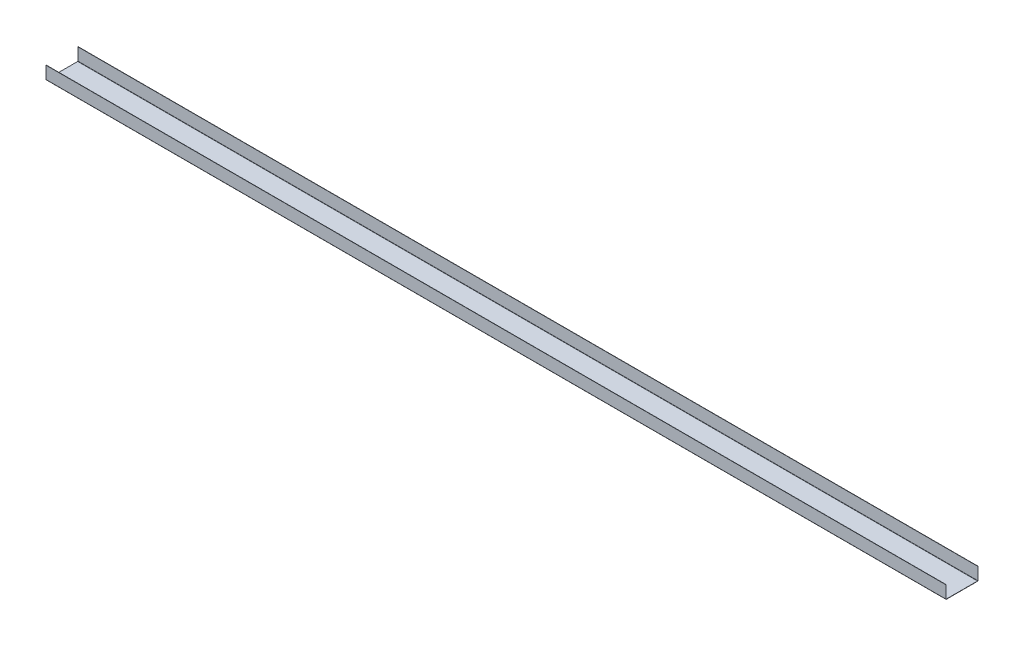
ISO-10303-21;
HEADER;
FILE_DESCRIPTION(('STEP AP214'),'2;1');
FILE_NAME('part.step','',(''),(''),'','','');
FILE_SCHEMA(('AUTOMOTIVE_DESIGN { 1 0 10303 214 1 1 1 1 }'));
ENDSEC;
DATA;
#1=APPLICATION_CONTEXT('core data for automotive mechanical design processes');
#2=APPLICATION_PROTOCOL_DEFINITION('international standard','automotive_design',2000,#1);
#3=PRODUCT_CONTEXT('',#1,'mechanical');
#4=PRODUCT('Part','Part','',(#3));
#5=PRODUCT_RELATED_PRODUCT_CATEGORY('part','',(#4));
#6=PRODUCT_DEFINITION_FORMATION('','',#4);
#7=PRODUCT_DEFINITION_CONTEXT('part definition',#1,'design');
#8=PRODUCT_DEFINITION('design','',#6,#7);
#9=PRODUCT_DEFINITION_SHAPE('','',#8);
#10=(LENGTH_UNIT() NAMED_UNIT(*) SI_UNIT(.MILLI.,.METRE.));
#11=(NAMED_UNIT(*) PLANE_ANGLE_UNIT() SI_UNIT($,.RADIAN.));
#12=(NAMED_UNIT(*) SI_UNIT($,.STERADIAN.) SOLID_ANGLE_UNIT());
#13=UNCERTAINTY_MEASURE_WITH_UNIT(LENGTH_MEASURE(1.E-05),#10,'distance_accuracy_value','');
#14=(GEOMETRIC_REPRESENTATION_CONTEXT(3) GLOBAL_UNCERTAINTY_ASSIGNED_CONTEXT((#13)) GLOBAL_UNIT_ASSIGNED_CONTEXT((#10,
#11,#12)) REPRESENTATION_CONTEXT('',''));
#15=CARTESIAN_POINT('',(0.,0.,0.));
#16=DIRECTION('',(0.,0.,1.));
#17=DIRECTION('',(1.,0.,0.));
#18=AXIS2_PLACEMENT_3D('',#15,#16,#17);
#19=CARTESIAN_POINT('',(2800.,1.5,100.));
#20=DIRECTION('',(1.,0.,0.));
#21=DIRECTION('',(0.,0.,-1.));
#22=AXIS2_PLACEMENT_3D('',#19,#20,#21);
#23=PLANE('',#22);
#24=DIRECTION('',(0.,0.,-1.));
#25=VECTOR('',#24,1.);
#26=CARTESIAN_POINT('',(2800.,1.5,100.));
#27=LINE('',#26,#25);
#28=CARTESIAN_POINT('',(2800.,1.5,100.));
#29=VERTEX_POINT('',#28);
#30=CARTESIAN_POINT('',(2800.,1.5,99.25));
#31=VERTEX_POINT('',#30);
#32=EDGE_CURVE('E11',#29,#31,#27,.T.);
#33=ORIENTED_EDGE('',*,*,#32,.F.);
#34=CARTESIAN_POINT('',(2800.,1.5,98.5));
#35=DIRECTION('',(-1.,0.,0.));
#36=DIRECTION('',(0.,0.,1.));
#37=AXIS2_PLACEMENT_3D('',#34,#35,#36);
#38=CIRCLE('',#37,1.5);
#39=CARTESIAN_POINT('',(2800.,0.,98.5));
#40=VERTEX_POINT('',#39);
#41=EDGE_CURVE('E146',#29,#40,#38,.F.);
#42=ORIENTED_EDGE('',*,*,#41,.T.);
#43=DIRECTION('',(0.,-1.,0.));
#44=VECTOR('',#43,1.);
#45=CARTESIAN_POINT('',(2800.,0.75,98.5));
#46=LINE('',#45,#44);
#47=CARTESIAN_POINT('',(2800.,0.75,98.5));
#48=VERTEX_POINT('',#47);
#49=EDGE_CURVE('E44',#48,#40,#46,.T.);
#50=ORIENTED_EDGE('',*,*,#49,.F.);
#51=CARTESIAN_POINT('',(2800.,1.5,98.5));
#52=DIRECTION('',(1.,0.,0.));
#53=DIRECTION('',(0.,0.,-1.));
#54=AXIS2_PLACEMENT_3D('',#51,#52,#53);
#55=CIRCLE('',#54,0.75);
#56=EDGE_CURVE('E240',#31,#48,#55,.T.);
#57=ORIENTED_EDGE('',*,*,#56,.F.);
#58=EDGE_LOOP('',(#33,#42,#50,#57));
#59=FACE_BOUND('',#58,.T.);
#60=ADVANCED_FACE('F36',(#59),#23,.T.);
#61=CARTESIAN_POINT('',(2800.,0.75,98.5));
#62=DIRECTION('',(1.,0.,0.));
#63=DIRECTION('',(0.,0.,-1.));
#64=AXIS2_PLACEMENT_3D('',#61,#62,#63);
#65=PLANE('',#64);
#66=DIRECTION('',(0.,-1.,0.));
#67=VECTOR('',#66,1.);
#68=CARTESIAN_POINT('',(2800.,0.,100.));
#69=LINE('',#68,#67);
#70=CARTESIAN_POINT('',(2800.,40.,100.));
#71=VERTEX_POINT('',#70);
#72=EDGE_CURVE('E151',#71,#29,#69,.T.);
#73=ORIENTED_EDGE('',*,*,#72,.T.);
#74=ORIENTED_EDGE('',*,*,#32,.T.);
#75=DIRECTION('',(0.,1.,0.));
#76=VECTOR('',#75,1.);
#77=CARTESIAN_POINT('',(2800.,0.,99.25));
#78=LINE('',#77,#76);
#79=CARTESIAN_POINT('',(2800.,40.,99.25));
#80=VERTEX_POINT('',#79);
#81=EDGE_CURVE('E253',#80,#31,#78,.F.);
#82=ORIENTED_EDGE('',*,*,#81,.F.);
#83=DIRECTION('',(0.,0.,-1.));
#84=VECTOR('',#83,1.);
#85=CARTESIAN_POINT('',(2800.,40.,100.));
#86=LINE('',#85,#84);
#87=EDGE_CURVE('E255',#71,#80,#86,.T.);
#88=ORIENTED_EDGE('',*,*,#87,.F.);
#89=EDGE_LOOP('',(#73,#74,#82,#88));
#90=FACE_BOUND('',#89,.T.);
#91=ADVANCED_FACE('F266',(#90),#65,.T.);
#92=CARTESIAN_POINT('',(0.,0.,98.5));
#93=DIRECTION('',(-1.,0.,0.));
#94=DIRECTION('',(0.,0.,1.));
#95=AXIS2_PLACEMENT_3D('',#92,#93,#94);
#96=PLANE('',#95);
#97=DIRECTION('',(0.,1.,0.));
#98=VECTOR('',#97,1.);
#99=CARTESIAN_POINT('',(0.,0.,98.5));
#100=LINE('',#99,#98);
#101=CARTESIAN_POINT('',(0.,0.,98.5));
#102=VERTEX_POINT('',#101);
#103=CARTESIAN_POINT('',(0.,0.75,98.5));
#104=VERTEX_POINT('',#103);
#105=EDGE_CURVE('E144',#102,#104,#100,.T.);
#106=ORIENTED_EDGE('',*,*,#105,.F.);
#107=CARTESIAN_POINT('',(0.,1.5,98.5));
#108=DIRECTION('',(-1.,0.,0.));
#109=DIRECTION('',(0.,0.,1.));
#110=AXIS2_PLACEMENT_3D('',#107,#108,#109);
#111=CIRCLE('',#110,1.5);
#112=CARTESIAN_POINT('',(0.,1.5,100.));
#113=VERTEX_POINT('',#112);
#114=EDGE_CURVE('E158',#113,#102,#111,.F.);
#115=ORIENTED_EDGE('',*,*,#114,.F.);
#116=DIRECTION('',(0.,0.,1.));
#117=VECTOR('',#116,1.);
#118=CARTESIAN_POINT('',(0.,1.5,99.25));
#119=LINE('',#118,#117);
#120=CARTESIAN_POINT('',(0.,1.5,99.25));
#121=VERTEX_POINT('',#120);
#122=EDGE_CURVE('E231',#121,#113,#119,.T.);
#123=ORIENTED_EDGE('',*,*,#122,.F.);
#124=CARTESIAN_POINT('',(0.,1.5,98.5));
#125=DIRECTION('',(1.,0.,0.));
#126=DIRECTION('',(0.,0.,-1.));
#127=AXIS2_PLACEMENT_3D('',#124,#125,#126);
#128=CIRCLE('',#127,0.75);
#129=EDGE_CURVE('E185',#121,#104,#128,.T.);
#130=ORIENTED_EDGE('',*,*,#129,.T.);
#131=EDGE_LOOP('',(#106,#115,#123,#130));
#132=FACE_BOUND('',#131,.T.);
#133=ADVANCED_FACE('F245',(#132),#96,.T.);
#134=CARTESIAN_POINT('',(0.,1.5,99.25));
#135=DIRECTION('',(-1.,0.,0.));
#136=DIRECTION('',(0.,0.,1.));
#137=AXIS2_PLACEMENT_3D('',#134,#135,#136);
#138=PLANE('',#137);
#139=DIRECTION('',(0.,0.,-1.));
#140=VECTOR('',#139,1.);
#141=CARTESIAN_POINT('',(0.,0.,100.));
#142=LINE('',#141,#140);
#143=CARTESIAN_POINT('',(0.,0.,1.5));
#144=VERTEX_POINT('',#143);
#145=EDGE_CURVE('E198',#102,#144,#142,.T.);
#146=ORIENTED_EDGE('',*,*,#145,.F.);
#147=ORIENTED_EDGE('',*,*,#105,.T.);
#148=DIRECTION('',(0.,0.,-1.));
#149=VECTOR('',#148,1.);
#150=CARTESIAN_POINT('',(0.,0.75,100.));
#151=LINE('',#150,#149);
#152=CARTESIAN_POINT('',(0.,0.75,1.5));
#153=VERTEX_POINT('',#152);
#154=EDGE_CURVE('E183',#104,#153,#151,.T.);
#155=ORIENTED_EDGE('',*,*,#154,.T.);
#156=DIRECTION('',(0.,-1.,0.));
#157=VECTOR('',#156,1.);
#158=CARTESIAN_POINT('',(0.,0.75,1.5));
#159=LINE('',#158,#157);
#160=EDGE_CURVE('E93',#153,#144,#159,.T.);
#161=ORIENTED_EDGE('',*,*,#160,.T.);
#162=EDGE_LOOP('',(#146,#147,#155,#161));
#163=FACE_BOUND('',#162,.T.);
#164=ADVANCED_FACE('F233',(#163),#138,.T.);
#165=CARTESIAN_POINT('',(2800.,0.,1.5));
#166=DIRECTION('',(1.,0.,0.));
#167=DIRECTION('',(0.,0.,-1.));
#168=AXIS2_PLACEMENT_3D('',#165,#166,#167);
#169=PLANE('',#168);
#170=DIRECTION('',(0.,1.,0.));
#171=VECTOR('',#170,1.);
#172=CARTESIAN_POINT('',(2800.,0.,1.5));
#173=LINE('',#172,#171);
#174=CARTESIAN_POINT('',(2800.,0.,1.5));
#175=VERTEX_POINT('',#174);
#176=CARTESIAN_POINT('',(2800.,0.75,1.5));
#177=VERTEX_POINT('',#176);
#178=EDGE_CURVE('E229',#175,#177,#173,.T.);
#179=ORIENTED_EDGE('',*,*,#178,.F.);
#180=CARTESIAN_POINT('',(2800.,1.5,1.5));
#181=DIRECTION('',(-1.,0.,0.));
#182=DIRECTION('',(0.,0.,1.));
#183=AXIS2_PLACEMENT_3D('',#180,#181,#182);
#184=CIRCLE('',#183,1.5);
#185=CARTESIAN_POINT('',(2800.,1.5,0.));
#186=VERTEX_POINT('',#185);
#187=EDGE_CURVE('E166',#175,#186,#184,.F.);
#188=ORIENTED_EDGE('',*,*,#187,.T.);
#189=DIRECTION('',(0.,0.,-1.));
#190=VECTOR('',#189,1.);
#191=CARTESIAN_POINT('',(2800.,1.5,0.75));
#192=LINE('',#191,#190);
#193=CARTESIAN_POINT('',(2800.,1.5,0.75));
#194=VERTEX_POINT('',#193);
#195=EDGE_CURVE('E52',#194,#186,#192,.T.);
#196=ORIENTED_EDGE('',*,*,#195,.F.);
#197=CARTESIAN_POINT('',(2800.,1.5,1.5));
#198=DIRECTION('',(1.,0.,0.));
#199=DIRECTION('',(0.,0.,-1.));
#200=AXIS2_PLACEMENT_3D('',#197,#198,#199);
#201=CIRCLE('',#200,0.75);
#202=EDGE_CURVE('E257',#177,#194,#201,.T.);
#203=ORIENTED_EDGE('',*,*,#202,.F.);
#204=EDGE_LOOP('',(#179,#188,#196,#203));
#205=FACE_BOUND('',#204,.T.);
#206=ADVANCED_FACE('F292',(#205),#169,.T.);
#207=CARTESIAN_POINT('',(2800.,1.5,0.75));
#208=DIRECTION('',(1.,0.,0.));
#209=DIRECTION('',(0.,0.,-1.));
#210=AXIS2_PLACEMENT_3D('',#207,#208,#209);
#211=PLANE('',#210);
#212=DIRECTION('',(0.,0.,-1.));
#213=VECTOR('',#212,1.);
#214=CARTESIAN_POINT('',(2800.,0.,100.));
#215=LINE('',#214,#213);
#216=EDGE_CURVE('E136',#40,#175,#215,.T.);
#217=ORIENTED_EDGE('',*,*,#216,.T.);
#218=ORIENTED_EDGE('',*,*,#178,.T.);
#219=DIRECTION('',(0.,0.,-1.));
#220=VECTOR('',#219,1.);
#221=CARTESIAN_POINT('',(2800.,0.75,100.));
#222=LINE('',#221,#220);
#223=EDGE_CURVE('E139',#48,#177,#222,.T.);
#224=ORIENTED_EDGE('',*,*,#223,.F.);
#225=ORIENTED_EDGE('',*,*,#49,.T.);
#226=EDGE_LOOP('',(#217,#218,#224,#225));
#227=FACE_BOUND('',#226,.T.);
#228=ADVANCED_FACE('F134',(#227),#211,.T.);
#229=CARTESIAN_POINT('',(0.,1.5,0.));
#230=DIRECTION('',(-1.,0.,0.));
#231=DIRECTION('',(0.,0.,1.));
#232=AXIS2_PLACEMENT_3D('',#229,#230,#231);
#233=PLANE('',#232);
#234=DIRECTION('',(0.,0.,1.));
#235=VECTOR('',#234,1.);
#236=CARTESIAN_POINT('',(0.,1.5,0.));
#237=LINE('',#236,#235);
#238=CARTESIAN_POINT('',(0.,1.5,0.));
#239=VERTEX_POINT('',#238);
#240=CARTESIAN_POINT('',(0.,1.5,0.75));
#241=VERTEX_POINT('',#240);
#242=EDGE_CURVE('E100',#239,#241,#237,.T.);
#243=ORIENTED_EDGE('',*,*,#242,.F.);
#244=CARTESIAN_POINT('',(0.,1.5,1.5));
#245=DIRECTION('',(-1.,0.,0.));
#246=DIRECTION('',(0.,0.,1.));
#247=AXIS2_PLACEMENT_3D('',#244,#245,#246);
#248=CIRCLE('',#247,1.5);
#249=EDGE_CURVE('E200',#144,#239,#248,.F.);
#250=ORIENTED_EDGE('',*,*,#249,.F.);
#251=ORIENTED_EDGE('',*,*,#160,.F.);
#252=CARTESIAN_POINT('',(0.,1.5,1.5));
#253=DIRECTION('',(1.,0.,0.));
#254=DIRECTION('',(0.,0.,-1.));
#255=AXIS2_PLACEMENT_3D('',#252,#253,#254);
#256=CIRCLE('',#255,0.75);
#257=EDGE_CURVE('E181',#153,#241,#256,.T.);
#258=ORIENTED_EDGE('',*,*,#257,.T.);
#259=EDGE_LOOP('',(#243,#250,#251,#258));
#260=FACE_BOUND('',#259,.T.);
#261=ADVANCED_FACE('F298',(#260),#233,.T.);
#262=CARTESIAN_POINT('',(0.,0.75,1.5));
#263=DIRECTION('',(-1.,0.,0.));
#264=DIRECTION('',(0.,0.,1.));
#265=AXIS2_PLACEMENT_3D('',#262,#263,#264);
#266=PLANE('',#265);
#267=DIRECTION('',(0.,1.,0.));
#268=VECTOR('',#267,1.);
#269=CARTESIAN_POINT('',(0.,0.,0.));
#270=LINE('',#269,#268);
#271=CARTESIAN_POINT('',(0.,40.,0.));
#272=VERTEX_POINT('',#271);
#273=EDGE_CURVE('E172',#239,#272,#270,.T.);
#274=ORIENTED_EDGE('',*,*,#273,.F.);
#275=ORIENTED_EDGE('',*,*,#242,.T.);
#276=DIRECTION('',(0.,1.,0.));
#277=VECTOR('',#276,1.);
#278=CARTESIAN_POINT('',(0.,0.,0.75));
#279=LINE('',#278,#277);
#280=CARTESIAN_POINT('',(0.,40.,0.75));
#281=VERTEX_POINT('',#280);
#282=EDGE_CURVE('E178',#241,#281,#279,.T.);
#283=ORIENTED_EDGE('',*,*,#282,.T.);
#284=DIRECTION('',(0.,0.,-1.));
#285=VECTOR('',#284,1.);
#286=CARTESIAN_POINT('',(0.,40.,0.75));
#287=LINE('',#286,#285);
#288=EDGE_CURVE('E175',#281,#272,#287,.T.);
#289=ORIENTED_EDGE('',*,*,#288,.T.);
#290=EDGE_LOOP('',(#274,#275,#283,#289));
#291=FACE_BOUND('',#290,.T.);
#292=ADVANCED_FACE('F301',(#291),#266,.T.);
#293=CARTESIAN_POINT('',(2800.,0.,0.));
#294=DIRECTION('',(0.,0.,1.));
#295=DIRECTION('',(0.,-1.,0.));
#296=AXIS2_PLACEMENT_3D('',#293,#294,#295);
#297=PLANE('',#296);
#298=ORIENTED_EDGE('',*,*,#273,.T.);
#299=DIRECTION('',(-1.,0.,0.));
#300=VECTOR('',#299,1.);
#301=CARTESIAN_POINT('',(2800.,40.,0.));
#302=LINE('',#301,#300);
#303=CARTESIAN_POINT('',(2800.,40.,0.));
#304=VERTEX_POINT('',#303);
#305=EDGE_CURVE('E224',#304,#272,#302,.T.);
#306=ORIENTED_EDGE('',*,*,#305,.F.);
#307=DIRECTION('',(0.,1.,0.));
#308=VECTOR('',#307,1.);
#309=CARTESIAN_POINT('',(2800.,0.,0.));
#310=LINE('',#309,#308);
#311=EDGE_CURVE('E106',#186,#304,#310,.T.);
#312=ORIENTED_EDGE('',*,*,#311,.F.);
#313=DIRECTION('',(-1.,0.,0.));
#314=VECTOR('',#313,1.);
#315=CARTESIAN_POINT('',(2800.,1.5,0.));
#316=LINE('',#315,#314);
#317=EDGE_CURVE('E168',#186,#239,#316,.T.);
#318=ORIENTED_EDGE('',*,*,#317,.T.);
#319=EDGE_LOOP('',(#298,#306,#312,#318));
#320=FACE_BOUND('',#319,.T.);
#321=ADVANCED_FACE('F304',(#320),#297,.F.);
#322=CARTESIAN_POINT('',(2800.,40.,0.75));
#323=DIRECTION('',(0.,1.,0.));
#324=DIRECTION('',(0.,0.,1.));
#325=AXIS2_PLACEMENT_3D('',#322,#323,#324);
#326=PLANE('',#325);
#327=ORIENTED_EDGE('',*,*,#288,.F.);
#328=DIRECTION('',(-1.,0.,0.));
#329=VECTOR('',#328,1.);
#330=CARTESIAN_POINT('',(2800.,40.,0.75));
#331=LINE('',#330,#329);
#332=CARTESIAN_POINT('',(2800.,40.,0.75));
#333=VERTEX_POINT('',#332);
#334=EDGE_CURVE('E222',#333,#281,#331,.T.);
#335=ORIENTED_EDGE('',*,*,#334,.F.);
#336=DIRECTION('',(0.,0.,-1.));
#337=VECTOR('',#336,1.);
#338=CARTESIAN_POINT('',(2800.,40.,0.75));
#339=LINE('',#338,#337);
#340=EDGE_CURVE('E512',#333,#304,#339,.T.);
#341=ORIENTED_EDGE('',*,*,#340,.T.);
#342=ORIENTED_EDGE('',*,*,#305,.T.);
#343=EDGE_LOOP('',(#327,#335,#341,#342));
#344=FACE_BOUND('',#343,.T.);
#345=ADVANCED_FACE('F308',(#344),#326,.T.);
#346=CARTESIAN_POINT('',(2800.,0.,0.75));
#347=DIRECTION('',(0.,0.,1.));
#348=DIRECTION('',(0.,-1.,0.));
#349=AXIS2_PLACEMENT_3D('',#346,#347,#348);
#350=PLANE('',#349);
#351=ORIENTED_EDGE('',*,*,#282,.F.);
#352=DIRECTION('',(-1.,0.,0.));
#353=VECTOR('',#352,1.);
#354=CARTESIAN_POINT('',(2800.,1.5,0.75));
#355=LINE('',#354,#353);
#356=EDGE_CURVE('E219',#194,#241,#355,.T.);
#357=ORIENTED_EDGE('',*,*,#356,.F.);
#358=DIRECTION('',(0.,1.,0.));
#359=VECTOR('',#358,1.);
#360=CARTESIAN_POINT('',(2800.,0.,0.75));
#361=LINE('',#360,#359);
#362=EDGE_CURVE('E514',#194,#333,#361,.T.);
#363=ORIENTED_EDGE('',*,*,#362,.T.);
#364=ORIENTED_EDGE('',*,*,#334,.T.);
#365=EDGE_LOOP('',(#351,#357,#363,#364));
#366=FACE_BOUND('',#365,.T.);
#367=ADVANCED_FACE('F312',(#366),#350,.T.);
#368=CARTESIAN_POINT('',(2800.,1.5,1.5));
#369=DIRECTION('',(-1.,0.,0.));
#370=DIRECTION('',(0.,0.,1.));
#371=AXIS2_PLACEMENT_3D('',#368,#369,#370);
#372=CYLINDRICAL_SURFACE('',#371,0.75);
#373=ORIENTED_EDGE('',*,*,#257,.F.);
#374=DIRECTION('',(-1.,0.,0.));
#375=VECTOR('',#374,1.);
#376=CARTESIAN_POINT('',(2800.,0.75,1.5));
#377=LINE('',#376,#375);
#378=EDGE_CURVE('E216',#177,#153,#377,.T.);
#379=ORIENTED_EDGE('',*,*,#378,.F.);
#380=ORIENTED_EDGE('',*,*,#202,.T.);
#381=ORIENTED_EDGE('',*,*,#356,.T.);
#382=EDGE_LOOP('',(#373,#379,#380,#381));
#383=FACE_BOUND('',#382,.T.);
#384=ADVANCED_FACE('F316',(#383),#372,.F.);
#385=CARTESIAN_POINT('',(2800.,0.75,100.));
#386=DIRECTION('',(0.,1.,0.));
#387=DIRECTION('',(0.,0.,1.));
#388=AXIS2_PLACEMENT_3D('',#385,#386,#387);
#389=PLANE('',#388);
#390=ORIENTED_EDGE('',*,*,#154,.F.);
#391=DIRECTION('',(-1.,0.,0.));
#392=VECTOR('',#391,1.);
#393=CARTESIAN_POINT('',(2800.,0.75,98.5));
#394=LINE('',#393,#392);
#395=EDGE_CURVE('E213',#48,#104,#394,.T.);
#396=ORIENTED_EDGE('',*,*,#395,.F.);
#397=ORIENTED_EDGE('',*,*,#223,.T.);
#398=ORIENTED_EDGE('',*,*,#378,.T.);
#399=EDGE_LOOP('',(#390,#396,#397,#398));
#400=FACE_BOUND('',#399,.T.);
#401=ADVANCED_FACE('F242',(#400),#389,.T.);
#402=CARTESIAN_POINT('',(2800.,1.5,98.5));
#403=DIRECTION('',(-1.,0.,0.));
#404=DIRECTION('',(0.,0.,1.));
#405=AXIS2_PLACEMENT_3D('',#402,#403,#404);
#406=CYLINDRICAL_SURFACE('',#405,0.75);
#407=ORIENTED_EDGE('',*,*,#129,.F.);
#408=DIRECTION('',(-1.,0.,0.));
#409=VECTOR('',#408,1.);
#410=CARTESIAN_POINT('',(2800.,1.5,99.25));
#411=LINE('',#410,#409);
#412=EDGE_CURVE('E210',#31,#121,#411,.T.);
#413=ORIENTED_EDGE('',*,*,#412,.F.);
#414=ORIENTED_EDGE('',*,*,#56,.T.);
#415=ORIENTED_EDGE('',*,*,#395,.T.);
#416=EDGE_LOOP('',(#407,#413,#414,#415));
#417=FACE_BOUND('',#416,.T.);
#418=ADVANCED_FACE('F238',(#417),#406,.F.);
#419=CARTESIAN_POINT('',(2800.,0.,99.25));
#420=DIRECTION('',(0.,0.,-1.));
#421=DIRECTION('',(-1.,0.,0.));
#422=AXIS2_PLACEMENT_3D('',#419,#420,#421);
#423=PLANE('',#422);
#424=DIRECTION('',(0.,1.,0.));
#425=VECTOR('',#424,1.);
#426=CARTESIAN_POINT('',(0.,0.,99.25));
#427=LINE('',#426,#425);
#428=CARTESIAN_POINT('',(0.,40.,99.25));
#429=VERTEX_POINT('',#428);
#430=EDGE_CURVE('E188',#429,#121,#427,.F.);
#431=ORIENTED_EDGE('',*,*,#430,.F.);
#432=DIRECTION('',(-1.,0.,0.));
#433=VECTOR('',#432,1.);
#434=CARTESIAN_POINT('',(2800.,40.,99.25));
#435=LINE('',#434,#433);
#436=EDGE_CURVE('E208',#80,#429,#435,.T.);
#437=ORIENTED_EDGE('',*,*,#436,.F.);
#438=ORIENTED_EDGE('',*,*,#81,.T.);
#439=ORIENTED_EDGE('',*,*,#412,.T.);
#440=EDGE_LOOP('',(#431,#437,#438,#439));
#441=FACE_BOUND('',#440,.T.);
#442=ADVANCED_FACE('F251',(#441),#423,.T.);
#443=CARTESIAN_POINT('',(2800.,40.,100.));
#444=DIRECTION('',(0.,1.,0.));
#445=DIRECTION('',(0.,0.,1.));
#446=AXIS2_PLACEMENT_3D('',#443,#444,#445);
#447=PLANE('',#446);
#448=DIRECTION('',(0.,0.,-1.));
#449=VECTOR('',#448,1.);
#450=CARTESIAN_POINT('',(0.,40.,100.));
#451=LINE('',#450,#449);
#452=CARTESIAN_POINT('',(0.,40.,100.));
#453=VERTEX_POINT('',#452);
#454=EDGE_CURVE('E191',#453,#429,#451,.T.);
#455=ORIENTED_EDGE('',*,*,#454,.F.);
#456=DIRECTION('',(-1.,0.,0.));
#457=VECTOR('',#456,1.);
#458=CARTESIAN_POINT('',(2800.,40.,100.));
#459=LINE('',#458,#457);
#460=EDGE_CURVE('E206',#71,#453,#459,.T.);
#461=ORIENTED_EDGE('',*,*,#460,.F.);
#462=ORIENTED_EDGE('',*,*,#87,.T.);
#463=ORIENTED_EDGE('',*,*,#436,.T.);
#464=EDGE_LOOP('',(#455,#461,#462,#463));
#465=FACE_BOUND('',#464,.T.);
#466=ADVANCED_FACE('F272',(#465),#447,.T.);
#467=CARTESIAN_POINT('',(2800.,0.,100.));
#468=DIRECTION('',(0.,0.,-1.));
#469=DIRECTION('',(-1.,0.,0.));
#470=AXIS2_PLACEMENT_3D('',#467,#468,#469);
#471=PLANE('',#470);
#472=DIRECTION('',(0.,-1.,0.));
#473=VECTOR('',#472,1.);
#474=CARTESIAN_POINT('',(0.,0.,100.));
#475=LINE('',#474,#473);
#476=EDGE_CURVE('E194',#453,#113,#475,.T.);
#477=ORIENTED_EDGE('',*,*,#476,.T.);
#478=DIRECTION('',(-1.,0.,0.));
#479=VECTOR('',#478,1.);
#480=CARTESIAN_POINT('',(2800.,1.5,100.));
#481=LINE('',#480,#479);
#482=EDGE_CURVE('E160',#29,#113,#481,.T.);
#483=ORIENTED_EDGE('',*,*,#482,.F.);
#484=ORIENTED_EDGE('',*,*,#72,.F.);
#485=ORIENTED_EDGE('',*,*,#460,.T.);
#486=EDGE_LOOP('',(#477,#483,#484,#485));
#487=FACE_BOUND('',#486,.T.);
#488=ADVANCED_FACE('F268',(#487),#471,.F.);
#489=CARTESIAN_POINT('',(2800.,1.5,98.5));
#490=DIRECTION('',(-1.,0.,0.));
#491=DIRECTION('',(0.,0.,1.));
#492=AXIS2_PLACEMENT_3D('',#489,#490,#491);
#493=CYLINDRICAL_SURFACE('',#492,1.5);
#494=ORIENTED_EDGE('',*,*,#114,.T.);
#495=DIRECTION('',(-1.,0.,0.));
#496=VECTOR('',#495,1.);
#497=CARTESIAN_POINT('',(2800.,0.,98.5));
#498=LINE('',#497,#496);
#499=EDGE_CURVE('E155',#40,#102,#498,.T.);
#500=ORIENTED_EDGE('',*,*,#499,.F.);
#501=ORIENTED_EDGE('',*,*,#41,.F.);
#502=ORIENTED_EDGE('',*,*,#482,.T.);
#503=EDGE_LOOP('',(#494,#500,#501,#502));
#504=FACE_BOUND('',#503,.T.);
#505=ADVANCED_FACE('F156',(#504),#493,.T.);
#506=CARTESIAN_POINT('',(2800.,0.,100.));
#507=DIRECTION('',(0.,1.,0.));
#508=DIRECTION('',(0.,0.,1.));
#509=AXIS2_PLACEMENT_3D('',#506,#507,#508);
#510=PLANE('',#509);
#511=ORIENTED_EDGE('',*,*,#145,.T.);
#512=DIRECTION('',(-1.,0.,0.));
#513=VECTOR('',#512,1.);
#514=CARTESIAN_POINT('',(2800.,0.,1.5));
#515=LINE('',#514,#513);
#516=EDGE_CURVE('E161',#175,#144,#515,.T.);
#517=ORIENTED_EDGE('',*,*,#516,.F.);
#518=ORIENTED_EDGE('',*,*,#216,.F.);
#519=ORIENTED_EDGE('',*,*,#499,.T.);
#520=EDGE_LOOP('',(#511,#517,#518,#519));
#521=FACE_BOUND('',#520,.T.);
#522=ADVANCED_FACE('F163',(#521),#510,.F.);
#523=CARTESIAN_POINT('',(2800.,1.5,1.5));
#524=DIRECTION('',(-1.,0.,0.));
#525=DIRECTION('',(0.,0.,1.));
#526=AXIS2_PLACEMENT_3D('',#523,#524,#525);
#527=CYLINDRICAL_SURFACE('',#526,1.5);
#528=ORIENTED_EDGE('',*,*,#249,.T.);
#529=ORIENTED_EDGE('',*,*,#317,.F.);
#530=ORIENTED_EDGE('',*,*,#187,.F.);
#531=ORIENTED_EDGE('',*,*,#516,.T.);
#532=EDGE_LOOP('',(#528,#529,#530,#531));
#533=FACE_BOUND('',#532,.T.);
#534=ADVANCED_FACE('F363',(#533),#527,.T.);
#535=CARTESIAN_POINT('',(2800.,1.5,1.5));
#536=DIRECTION('',(1.,0.,0.));
#537=DIRECTION('',(0.,0.,-1.));
#538=AXIS2_PLACEMENT_3D('',#535,#536,#537);
#539=PLANE('',#538);
#540=ORIENTED_EDGE('',*,*,#311,.T.);
#541=ORIENTED_EDGE('',*,*,#340,.F.);
#542=ORIENTED_EDGE('',*,*,#362,.F.);
#543=ORIENTED_EDGE('',*,*,#195,.T.);
#544=EDGE_LOOP('',(#540,#541,#542,#543));
#545=FACE_BOUND('',#544,.T.);
#546=ADVANCED_FACE('F373',(#545),#539,.T.);
#547=CARTESIAN_POINT('',(0.,1.5,1.5));
#548=DIRECTION('',(1.,0.,0.));
#549=DIRECTION('',(0.,0.,-1.));
#550=AXIS2_PLACEMENT_3D('',#547,#548,#549);
#551=PLANE('',#550);
#552=ORIENTED_EDGE('',*,*,#430,.T.);
#553=ORIENTED_EDGE('',*,*,#122,.T.);
#554=ORIENTED_EDGE('',*,*,#476,.F.);
#555=ORIENTED_EDGE('',*,*,#454,.T.);
#556=EDGE_LOOP('',(#552,#553,#554,#555));
#557=FACE_BOUND('',#556,.T.);
#558=ADVANCED_FACE('F270',(#557),#551,.F.);
#559=CLOSED_SHELL('',(#60,#91,#133,#164,#206,#228,#261,#292,#321,#345,#367,#384,#401,#418,#442,
#466,#488,#505,#522,#534,#546,#558));
#560=MANIFOLD_SOLID_BREP('B2',#559);
#561=ADVANCED_BREP_SHAPE_REPRESENTATION('',(#18,#560),#14);
#562=SHAPE_DEFINITION_REPRESENTATION(#9,#561);
ENDSEC;
END-ISO-10303-21;
